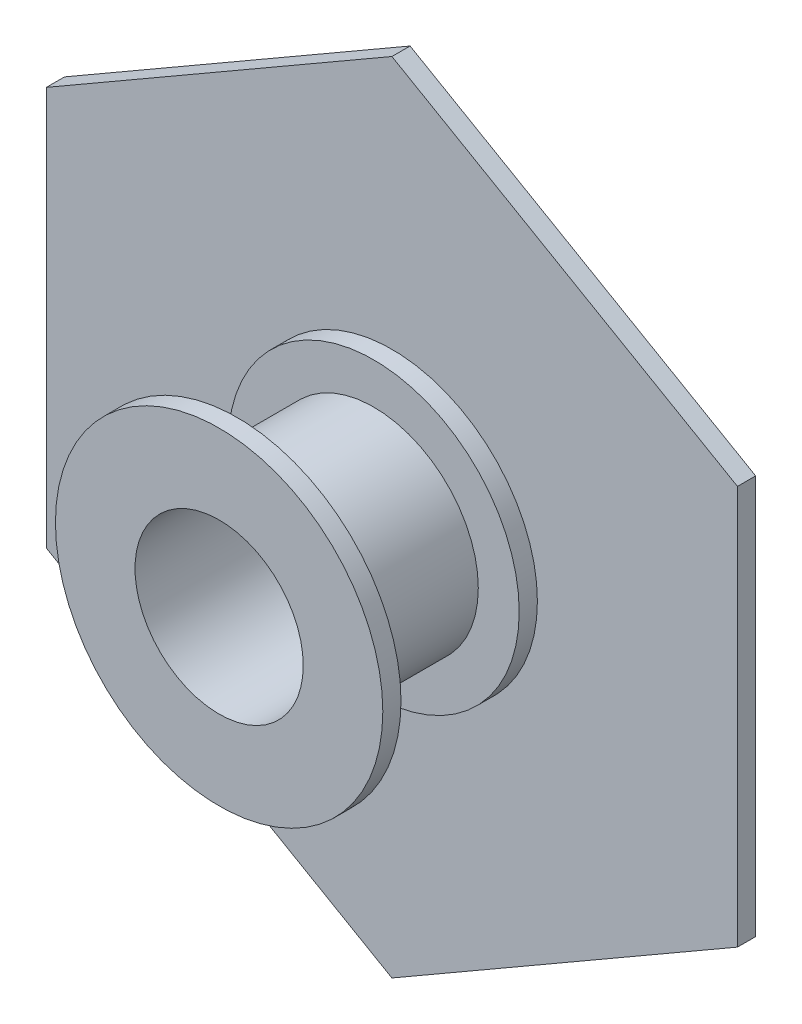
ISO-10303-21;
HEADER;
FILE_DESCRIPTION(('STEP AP214'),'2;1');
FILE_NAME('part.step','',(''),(''),'','','');
FILE_SCHEMA(('AUTOMOTIVE_DESIGN { 1 0 10303 214 1 1 1 1 }'));
ENDSEC;
DATA;
#1=APPLICATION_CONTEXT('core data for automotive mechanical design processes');
#2=APPLICATION_PROTOCOL_DEFINITION('international standard','automotive_design',2000,#1);
#3=PRODUCT_CONTEXT('',#1,'mechanical');
#4=PRODUCT('Part','Part','',(#3));
#5=PRODUCT_RELATED_PRODUCT_CATEGORY('part','',(#4));
#6=PRODUCT_DEFINITION_FORMATION('','',#4);
#7=PRODUCT_DEFINITION_CONTEXT('part definition',#1,'design');
#8=PRODUCT_DEFINITION('design','',#6,#7);
#9=PRODUCT_DEFINITION_SHAPE('','',#8);
#10=(LENGTH_UNIT() NAMED_UNIT(*) SI_UNIT(.MILLI.,.METRE.));
#11=(NAMED_UNIT(*) PLANE_ANGLE_UNIT() SI_UNIT($,.RADIAN.));
#12=(NAMED_UNIT(*) SI_UNIT($,.STERADIAN.) SOLID_ANGLE_UNIT());
#13=UNCERTAINTY_MEASURE_WITH_UNIT(LENGTH_MEASURE(1.E-05),#10,'distance_accuracy_value','');
#14=(GEOMETRIC_REPRESENTATION_CONTEXT(3) GLOBAL_UNCERTAINTY_ASSIGNED_CONTEXT((#13)) GLOBAL_UNIT_ASSIGNED_CONTEXT((#10,
#11,#12)) REPRESENTATION_CONTEXT('',''));
#15=CARTESIAN_POINT('',(0.,0.,0.));
#16=DIRECTION('',(0.,0.,1.));
#17=DIRECTION('',(1.,0.,0.));
#18=AXIS2_PLACEMENT_3D('',#15,#16,#17);
#19=CARTESIAN_POINT('',(0.,0.,6.35));
#20=DIRECTION('',(0.,0.,1.));
#21=DIRECTION('',(1.,0.,0.));
#22=AXIS2_PLACEMENT_3D('',#19,#20,#21);
#23=PLANE('',#22);
#24=DIRECTION('',(0.,1.,0.));
#25=VECTOR('',#24,1.);
#26=CARTESIAN_POINT('',(120.65,-69.6573099777283,6.35));
#27=LINE('',#26,#25);
#28=CARTESIAN_POINT('',(120.65,-69.6573099777283,6.35));
#29=VERTEX_POINT('',#28);
#30=CARTESIAN_POINT('',(120.65,69.6573099777283,6.35));
#31=VERTEX_POINT('',#30);
#32=EDGE_CURVE('E130',#29,#31,#27,.T.);
#33=ORIENTED_EDGE('',*,*,#32,.T.);
#34=DIRECTION('',(-0.866025403784439,0.5,0.));
#35=VECTOR('',#34,1.);
#36=CARTESIAN_POINT('',(120.65,69.6573099777283,6.35));
#37=LINE('',#36,#35);
#38=CARTESIAN_POINT('',(0.,139.314619955457,6.35));
#39=VERTEX_POINT('',#38);
#40=EDGE_CURVE('E88',#31,#39,#37,.T.);
#41=ORIENTED_EDGE('',*,*,#40,.T.);
#42=DIRECTION('',(-0.866025403784438,-0.5,0.));
#43=VECTOR('',#42,1.);
#44=CARTESIAN_POINT('',(0.,139.314619955457,6.35));
#45=LINE('',#44,#43);
#46=CARTESIAN_POINT('',(-120.65,69.6573099777283,6.35));
#47=VERTEX_POINT('',#46);
#48=EDGE_CURVE('E101',#39,#47,#45,.T.);
#49=ORIENTED_EDGE('',*,*,#48,.T.);
#50=DIRECTION('',(0.,-1.,0.));
#51=VECTOR('',#50,1.);
#52=CARTESIAN_POINT('',(-120.65,69.6573099777283,6.35));
#53=LINE('',#52,#51);
#54=CARTESIAN_POINT('',(-120.65,-69.6573099777284,6.35));
#55=VERTEX_POINT('',#54);
#56=EDGE_CURVE('E95',#47,#55,#53,.T.);
#57=ORIENTED_EDGE('',*,*,#56,.T.);
#58=DIRECTION('',(0.866025403784439,-0.5,0.));
#59=VECTOR('',#58,1.);
#60=CARTESIAN_POINT('',(-120.65,-69.6573099777284,6.35));
#61=LINE('',#60,#59);
#62=CARTESIAN_POINT('',(0.,-139.314619955457,6.35));
#63=VERTEX_POINT('',#62);
#64=EDGE_CURVE('E99',#55,#63,#61,.T.);
#65=ORIENTED_EDGE('',*,*,#64,.T.);
#66=DIRECTION('',(0.866025403784439,0.5,0.));
#67=VECTOR('',#66,1.);
#68=CARTESIAN_POINT('',(0.,-139.314619955457,6.35));
#69=LINE('',#68,#67);
#70=EDGE_CURVE('E51',#63,#29,#69,.T.);
#71=ORIENTED_EDGE('',*,*,#70,.T.);
#72=EDGE_LOOP('',(#33,#41,#49,#57,#65,#71));
#73=FACE_BOUND('',#72,.T.);
#74=CARTESIAN_POINT('',(0.,0.,6.35));
#75=DIRECTION('',(0.,0.,1.));
#76=DIRECTION('',(1.,0.,0.));
#77=AXIS2_PLACEMENT_3D('',#74,#75,#76);
#78=CIRCLE('',#77,50.8);
#79=CARTESIAN_POINT('',(50.8,0.,6.35));
#80=VERTEX_POINT('',#79);
#81=EDGE_CURVE('E196',#80,#80,#78,.T.);
#82=ORIENTED_EDGE('',*,*,#81,.F.);
#83=EDGE_LOOP('',(#82));
#84=FACE_BOUND('',#83,.T.);
#85=ADVANCED_FACE('F34',(#73,#84),#23,.T.);
#86=CARTESIAN_POINT('',(120.65,-69.6573099777283,6.35));
#87=DIRECTION('',(-1.,0.,0.));
#88=DIRECTION('',(0.,-1.,0.));
#89=AXIS2_PLACEMENT_3D('',#86,#87,#88);
#90=PLANE('',#89);
#91=DIRECTION('',(0.,1.,0.));
#92=VECTOR('',#91,1.);
#93=CARTESIAN_POINT('',(120.65,-69.6573099777283,0.));
#94=LINE('',#93,#92);
#95=CARTESIAN_POINT('',(120.65,-69.6573099777283,0.));
#96=VERTEX_POINT('',#95);
#97=CARTESIAN_POINT('',(120.65,69.6573099777283,0.));
#98=VERTEX_POINT('',#97);
#99=EDGE_CURVE('E119',#96,#98,#94,.T.);
#100=ORIENTED_EDGE('',*,*,#99,.T.);
#101=DIRECTION('',(0.,0.,-1.));
#102=VECTOR('',#101,1.);
#103=CARTESIAN_POINT('',(120.65,69.6573099777283,6.35));
#104=LINE('',#103,#102);
#105=EDGE_CURVE('E11',#31,#98,#104,.T.);
#106=ORIENTED_EDGE('',*,*,#105,.F.);
#107=ORIENTED_EDGE('',*,*,#32,.F.);
#108=DIRECTION('',(0.,0.,-1.));
#109=VECTOR('',#108,1.);
#110=CARTESIAN_POINT('',(120.65,-69.6573099777283,6.35));
#111=LINE('',#110,#109);
#112=EDGE_CURVE('E115',#29,#96,#111,.T.);
#113=ORIENTED_EDGE('',*,*,#112,.T.);
#114=EDGE_LOOP('',(#100,#106,#107,#113));
#115=FACE_BOUND('',#114,.T.);
#116=ADVANCED_FACE('F36',(#115),#90,.F.);
#117=CARTESIAN_POINT('',(120.65,69.6573099777283,6.35));
#118=DIRECTION('',(-0.5,-0.866025403784438,0.));
#119=DIRECTION('',(0.866025403784439,-0.5,0.));
#120=AXIS2_PLACEMENT_3D('',#117,#118,#119);
#121=PLANE('',#120);
#122=DIRECTION('',(-0.866025403784439,0.5,0.));
#123=VECTOR('',#122,1.);
#124=CARTESIAN_POINT('',(120.65,69.6573099777283,0.));
#125=LINE('',#124,#123);
#126=CARTESIAN_POINT('',(0.,139.314619955457,0.));
#127=VERTEX_POINT('',#126);
#128=EDGE_CURVE('E122',#98,#127,#125,.T.);
#129=ORIENTED_EDGE('',*,*,#128,.T.);
#130=DIRECTION('',(0.,0.,-1.));
#131=VECTOR('',#130,1.);
#132=CARTESIAN_POINT('',(0.,139.314619955457,6.35));
#133=LINE('',#132,#131);
#134=EDGE_CURVE('E43',#39,#127,#133,.T.);
#135=ORIENTED_EDGE('',*,*,#134,.F.);
#136=ORIENTED_EDGE('',*,*,#40,.F.);
#137=ORIENTED_EDGE('',*,*,#105,.T.);
#138=EDGE_LOOP('',(#129,#135,#136,#137));
#139=FACE_BOUND('',#138,.T.);
#140=ADVANCED_FACE('F159',(#139),#121,.F.);
#141=CARTESIAN_POINT('',(0.,139.314619955457,6.35));
#142=DIRECTION('',(0.5,-0.866025403784438,0.));
#143=DIRECTION('',(0.866025403784438,0.5,0.));
#144=AXIS2_PLACEMENT_3D('',#141,#142,#143);
#145=PLANE('',#144);
#146=DIRECTION('',(-0.866025403784438,-0.5,0.));
#147=VECTOR('',#146,1.);
#148=CARTESIAN_POINT('',(0.,139.314619955457,0.));
#149=LINE('',#148,#147);
#150=CARTESIAN_POINT('',(-120.65,69.6573099777283,0.));
#151=VERTEX_POINT('',#150);
#152=EDGE_CURVE('E125',#127,#151,#149,.T.);
#153=ORIENTED_EDGE('',*,*,#152,.T.);
#154=DIRECTION('',(0.,0.,-1.));
#155=VECTOR('',#154,1.);
#156=CARTESIAN_POINT('',(-120.65,69.6573099777283,6.35));
#157=LINE('',#156,#155);
#158=EDGE_CURVE('E110',#47,#151,#157,.T.);
#159=ORIENTED_EDGE('',*,*,#158,.F.);
#160=ORIENTED_EDGE('',*,*,#48,.F.);
#161=ORIENTED_EDGE('',*,*,#134,.T.);
#162=EDGE_LOOP('',(#153,#159,#160,#161));
#163=FACE_BOUND('',#162,.T.);
#164=ADVANCED_FACE('F136',(#163),#145,.F.);
#165=CARTESIAN_POINT('',(-120.65,69.6573099777283,6.35));
#166=DIRECTION('',(1.,0.,0.));
#167=DIRECTION('',(0.,1.,0.));
#168=AXIS2_PLACEMENT_3D('',#165,#166,#167);
#169=PLANE('',#168);
#170=DIRECTION('',(0.,-1.,0.));
#171=VECTOR('',#170,1.);
#172=CARTESIAN_POINT('',(-120.65,69.6573099777283,0.));
#173=LINE('',#172,#171);
#174=CARTESIAN_POINT('',(-120.65,-69.6573099777284,0.));
#175=VERTEX_POINT('',#174);
#176=EDGE_CURVE('E109',#151,#175,#173,.T.);
#177=ORIENTED_EDGE('',*,*,#176,.T.);
#178=DIRECTION('',(0.,0.,-1.));
#179=VECTOR('',#178,1.);
#180=CARTESIAN_POINT('',(-120.65,-69.6573099777284,6.35));
#181=LINE('',#180,#179);
#182=EDGE_CURVE('E106',#55,#175,#181,.T.);
#183=ORIENTED_EDGE('',*,*,#182,.F.);
#184=ORIENTED_EDGE('',*,*,#56,.F.);
#185=ORIENTED_EDGE('',*,*,#158,.T.);
#186=EDGE_LOOP('',(#177,#183,#184,#185));
#187=FACE_BOUND('',#186,.T.);
#188=ADVANCED_FACE('F107',(#187),#169,.F.);
#189=CARTESIAN_POINT('',(-120.65,-69.6573099777284,6.35));
#190=DIRECTION('',(0.5,0.866025403784439,0.));
#191=DIRECTION('',(-0.866025403784439,0.5,0.));
#192=AXIS2_PLACEMENT_3D('',#189,#190,#191);
#193=PLANE('',#192);
#194=DIRECTION('',(0.866025403784439,-0.5,0.));
#195=VECTOR('',#194,1.);
#196=CARTESIAN_POINT('',(-120.65,-69.6573099777284,0.));
#197=LINE('',#196,#195);
#198=CARTESIAN_POINT('',(0.,-139.314619955457,0.));
#199=VERTEX_POINT('',#198);
#200=EDGE_CURVE('E74',#175,#199,#197,.T.);
#201=ORIENTED_EDGE('',*,*,#200,.T.);
#202=DIRECTION('',(0.,0.,-1.));
#203=VECTOR('',#202,1.);
#204=CARTESIAN_POINT('',(0.,-139.314619955457,6.35));
#205=LINE('',#204,#203);
#206=EDGE_CURVE('E111',#63,#199,#205,.T.);
#207=ORIENTED_EDGE('',*,*,#206,.F.);
#208=ORIENTED_EDGE('',*,*,#64,.F.);
#209=ORIENTED_EDGE('',*,*,#182,.T.);
#210=EDGE_LOOP('',(#201,#207,#208,#209));
#211=FACE_BOUND('',#210,.T.);
#212=ADVANCED_FACE('F113',(#211),#193,.F.);
#213=CARTESIAN_POINT('',(0.,-139.314619955457,6.35));
#214=DIRECTION('',(-0.5,0.866025403784439,0.));
#215=DIRECTION('',(-0.866025403784439,-0.5,0.));
#216=AXIS2_PLACEMENT_3D('',#213,#214,#215);
#217=PLANE('',#216);
#218=DIRECTION('',(0.866025403784439,0.5,0.));
#219=VECTOR('',#218,1.);
#220=CARTESIAN_POINT('',(0.,-139.314619955457,0.));
#221=LINE('',#220,#219);
#222=EDGE_CURVE('E80',#199,#96,#221,.T.);
#223=ORIENTED_EDGE('',*,*,#222,.T.);
#224=ORIENTED_EDGE('',*,*,#112,.F.);
#225=ORIENTED_EDGE('',*,*,#70,.F.);
#226=ORIENTED_EDGE('',*,*,#206,.T.);
#227=EDGE_LOOP('',(#223,#224,#225,#226));
#228=FACE_BOUND('',#227,.T.);
#229=ADVANCED_FACE('F143',(#228),#217,.F.);
#230=CARTESIAN_POINT('',(0.,0.,0.));
#231=DIRECTION('',(0.,0.,1.));
#232=DIRECTION('',(1.,0.,0.));
#233=AXIS2_PLACEMENT_3D('',#230,#231,#232);
#234=PLANE('',#233);
#235=CARTESIAN_POINT('',(0.,0.,0.));
#236=DIRECTION('',(0.,0.,1.));
#237=DIRECTION('',(1.,0.,0.));
#238=AXIS2_PLACEMENT_3D('',#235,#236,#237);
#239=CIRCLE('',#238,29.36875);
#240=CARTESIAN_POINT('',(29.36875,0.,0.));
#241=VERTEX_POINT('',#240);
#242=EDGE_CURVE('E123',#241,#241,#239,.T.);
#243=ORIENTED_EDGE('',*,*,#242,.T.);
#244=EDGE_LOOP('',(#243));
#245=FACE_BOUND('',#244,.T.);
#246=ORIENTED_EDGE('',*,*,#99,.F.);
#247=ORIENTED_EDGE('',*,*,#222,.F.);
#248=ORIENTED_EDGE('',*,*,#200,.F.);
#249=ORIENTED_EDGE('',*,*,#176,.F.);
#250=ORIENTED_EDGE('',*,*,#152,.F.);
#251=ORIENTED_EDGE('',*,*,#128,.F.);
#252=EDGE_LOOP('',(#246,#247,#248,#249,#250,#251));
#253=FACE_BOUND('',#252,.T.);
#254=ADVANCED_FACE('F139',(#245,#253),#234,.F.);
#255=CARTESIAN_POINT('',(0.,0.,0.));
#256=DIRECTION('',(0.,0.,1.));
#257=DIRECTION('',(1.,0.,0.));
#258=AXIS2_PLACEMENT_3D('',#255,#256,#257);
#259=CYLINDRICAL_SURFACE('',#258,29.36875);
#260=ORIENTED_EDGE('',*,*,#242,.F.);
#261=EDGE_LOOP('',(#260));
#262=FACE_BOUND('',#261,.T.);
#263=CARTESIAN_POINT('',(0.,0.,66.675));
#264=DIRECTION('',(0.,0.,1.));
#265=DIRECTION('',(1.,0.,0.));
#266=AXIS2_PLACEMENT_3D('',#263,#264,#265);
#267=CIRCLE('',#266,29.36875);
#268=CARTESIAN_POINT('',(29.36875,0.,66.675));
#269=VERTEX_POINT('',#268);
#270=EDGE_CURVE('E201',#269,#269,#267,.T.);
#271=ORIENTED_EDGE('',*,*,#270,.T.);
#272=EDGE_LOOP('',(#271));
#273=FACE_BOUND('',#272,.T.);
#274=ADVANCED_FACE('F150',(#262,#273),#259,.F.);
#275=CARTESIAN_POINT('',(0.,0.,60.325));
#276=DIRECTION('',(0.,0.,-1.));
#277=DIRECTION('',(-1.,0.,0.));
#278=AXIS2_PLACEMENT_3D('',#275,#276,#277);
#279=CYLINDRICAL_SURFACE('',#278,36.5125);
#280=CARTESIAN_POINT('',(0.,0.,12.7));
#281=DIRECTION('',(0.,0.,1.));
#282=DIRECTION('',(1.,0.,0.));
#283=AXIS2_PLACEMENT_3D('',#280,#281,#282);
#284=CIRCLE('',#283,36.5125);
#285=CARTESIAN_POINT('',(36.5125,0.,12.7));
#286=VERTEX_POINT('',#285);
#287=EDGE_CURVE('E195',#286,#286,#284,.T.);
#288=ORIENTED_EDGE('',*,*,#287,.T.);
#289=EDGE_LOOP('',(#288));
#290=FACE_BOUND('',#289,.T.);
#291=CARTESIAN_POINT('',(0.,0.,60.325));
#292=DIRECTION('',(0.,0.,1.));
#293=DIRECTION('',(1.,0.,0.));
#294=AXIS2_PLACEMENT_3D('',#291,#292,#293);
#295=CIRCLE('',#294,36.5125);
#296=CARTESIAN_POINT('',(36.5125,0.,60.325));
#297=VERTEX_POINT('',#296);
#298=EDGE_CURVE('E209',#297,#297,#295,.T.);
#299=ORIENTED_EDGE('',*,*,#298,.F.);
#300=EDGE_LOOP('',(#299));
#301=FACE_BOUND('',#300,.T.);
#302=ADVANCED_FACE('F163',(#290,#301),#279,.T.);
#303=CARTESIAN_POINT('',(0.,0.,66.675));
#304=DIRECTION('',(0.,0.,1.));
#305=DIRECTION('',(1.,0.,0.));
#306=AXIS2_PLACEMENT_3D('',#303,#304,#305);
#307=PLANE('',#306);
#308=CARTESIAN_POINT('',(0.,0.,66.675));
#309=DIRECTION('',(0.,0.,1.));
#310=DIRECTION('',(1.,0.,0.));
#311=AXIS2_PLACEMENT_3D('',#308,#309,#310);
#312=CIRCLE('',#311,57.15);
#313=CARTESIAN_POINT('',(57.15,0.,66.675));
#314=VERTEX_POINT('',#313);
#315=EDGE_CURVE('E206',#314,#314,#312,.T.);
#316=ORIENTED_EDGE('',*,*,#315,.T.);
#317=EDGE_LOOP('',(#316));
#318=FACE_BOUND('',#317,.T.);
#319=ORIENTED_EDGE('',*,*,#270,.F.);
#320=EDGE_LOOP('',(#319));
#321=FACE_BOUND('',#320,.T.);
#322=ADVANCED_FACE('F167',(#318,#321),#307,.T.);
#323=CARTESIAN_POINT('',(0.,0.,60.325));
#324=DIRECTION('',(0.,0.,1.));
#325=DIRECTION('',(1.,0.,0.));
#326=AXIS2_PLACEMENT_3D('',#323,#324,#325);
#327=PLANE('',#326);
#328=ORIENTED_EDGE('',*,*,#298,.T.);
#329=EDGE_LOOP('',(#328));
#330=FACE_BOUND('',#329,.T.);
#331=CARTESIAN_POINT('',(0.,0.,60.325));
#332=DIRECTION('',(0.,0.,1.));
#333=DIRECTION('',(1.,0.,0.));
#334=AXIS2_PLACEMENT_3D('',#331,#332,#333);
#335=CIRCLE('',#334,57.15);
#336=CARTESIAN_POINT('',(57.15,0.,60.325));
#337=VERTEX_POINT('',#336);
#338=EDGE_CURVE('E205',#337,#337,#335,.T.);
#339=ORIENTED_EDGE('',*,*,#338,.F.);
#340=EDGE_LOOP('',(#339));
#341=FACE_BOUND('',#340,.T.);
#342=ADVANCED_FACE('F173',(#330,#341),#327,.F.);
#343=CARTESIAN_POINT('',(0.,0.,66.675));
#344=DIRECTION('',(0.,0.,-1.));
#345=DIRECTION('',(-1.,0.,0.));
#346=AXIS2_PLACEMENT_3D('',#343,#344,#345);
#347=CYLINDRICAL_SURFACE('',#346,57.15);
#348=ORIENTED_EDGE('',*,*,#315,.F.);
#349=EDGE_LOOP('',(#348));
#350=FACE_BOUND('',#349,.T.);
#351=ORIENTED_EDGE('',*,*,#338,.T.);
#352=EDGE_LOOP('',(#351));
#353=FACE_BOUND('',#352,.T.);
#354=ADVANCED_FACE('F169',(#350,#353),#347,.T.);
#355=CARTESIAN_POINT('',(0.,0.,12.7));
#356=DIRECTION('',(0.,0.,1.));
#357=DIRECTION('',(1.,0.,0.));
#358=AXIS2_PLACEMENT_3D('',#355,#356,#357);
#359=PLANE('',#358);
#360=CARTESIAN_POINT('',(0.,0.,12.7));
#361=DIRECTION('',(0.,0.,1.));
#362=DIRECTION('',(1.,0.,0.));
#363=AXIS2_PLACEMENT_3D('',#360,#361,#362);
#364=CIRCLE('',#363,50.8);
#365=CARTESIAN_POINT('',(50.8,0.,12.7));
#366=VERTEX_POINT('',#365);
#367=EDGE_CURVE('E192',#366,#366,#364,.T.);
#368=ORIENTED_EDGE('',*,*,#367,.T.);
#369=EDGE_LOOP('',(#368));
#370=FACE_BOUND('',#369,.T.);
#371=ORIENTED_EDGE('',*,*,#287,.F.);
#372=EDGE_LOOP('',(#371));
#373=FACE_BOUND('',#372,.T.);
#374=ADVANCED_FACE('F172',(#370,#373),#359,.T.);
#375=CARTESIAN_POINT('',(0.,0.,12.7));
#376=DIRECTION('',(0.,0.,-1.));
#377=DIRECTION('',(-1.,0.,0.));
#378=AXIS2_PLACEMENT_3D('',#375,#376,#377);
#379=CYLINDRICAL_SURFACE('',#378,50.8);
#380=ORIENTED_EDGE('',*,*,#367,.F.);
#381=EDGE_LOOP('',(#380));
#382=FACE_BOUND('',#381,.T.);
#383=ORIENTED_EDGE('',*,*,#81,.T.);
#384=EDGE_LOOP('',(#383));
#385=FACE_BOUND('',#384,.T.);
#386=ADVANCED_FACE('F181',(#382,#385),#379,.T.);
#387=CLOSED_SHELL('',(#85,#116,#140,#164,#188,#212,#229,#254,#274,#302,#322,#342,#354,#374,#386));
#388=MANIFOLD_SOLID_BREP('B2',#387);
#389=ADVANCED_BREP_SHAPE_REPRESENTATION('',(#18,#388),#14);
#390=SHAPE_DEFINITION_REPRESENTATION(#9,#389);
ENDSEC;
END-ISO-10303-21;
